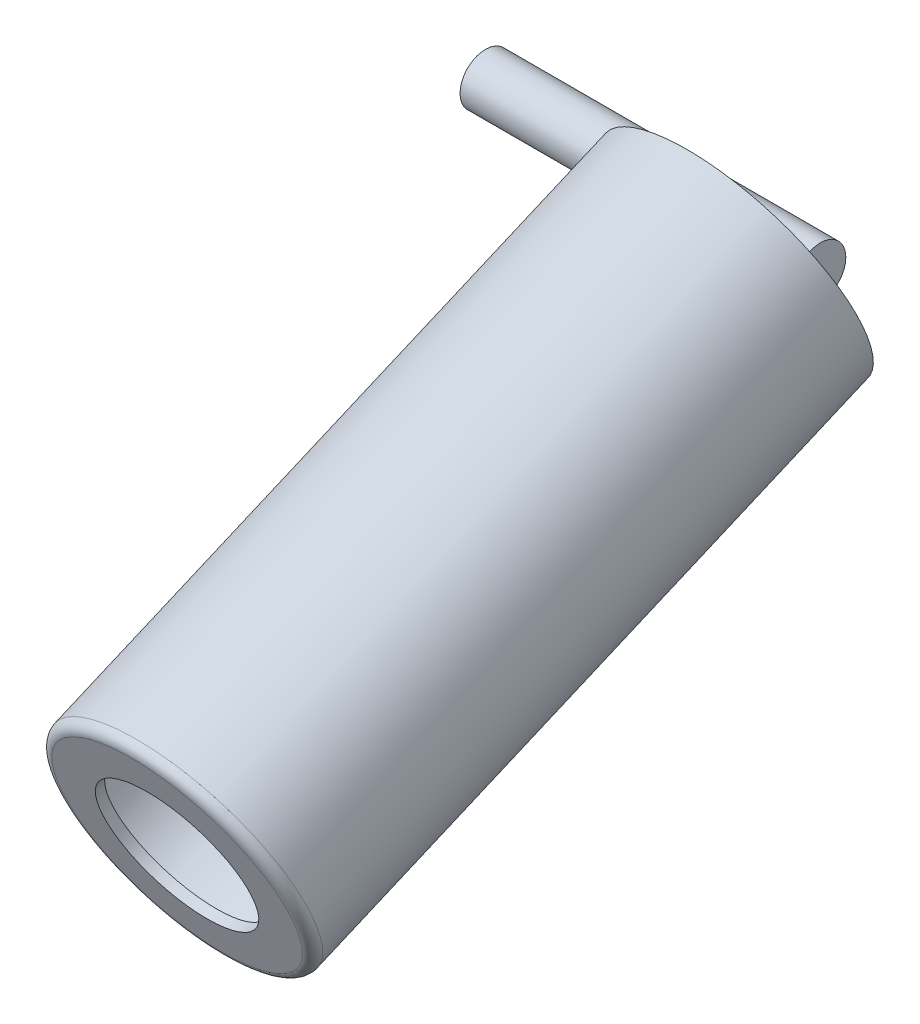
ISO-10303-21;
HEADER;
FILE_DESCRIPTION(('STEP AP214'),'2;1');
FILE_NAME('part.step','',(''),(''),'','','');
FILE_SCHEMA(('AUTOMOTIVE_DESIGN { 1 0 10303 214 1 1 1 1 }'));
ENDSEC;
DATA;
#1=APPLICATION_CONTEXT('core data for automotive mechanical design processes');
#2=APPLICATION_PROTOCOL_DEFINITION('international standard','automotive_design',2000,#1);
#3=PRODUCT_CONTEXT('',#1,'mechanical');
#4=PRODUCT('Part','Part','',(#3));
#5=PRODUCT_RELATED_PRODUCT_CATEGORY('part','',(#4));
#6=PRODUCT_DEFINITION_FORMATION('','',#4);
#7=PRODUCT_DEFINITION_CONTEXT('part definition',#1,'design');
#8=PRODUCT_DEFINITION('design','',#6,#7);
#9=PRODUCT_DEFINITION_SHAPE('','',#8);
#10=(LENGTH_UNIT() NAMED_UNIT(*) SI_UNIT(.MILLI.,.METRE.));
#11=(NAMED_UNIT(*) PLANE_ANGLE_UNIT() SI_UNIT($,.RADIAN.));
#12=(NAMED_UNIT(*) SI_UNIT($,.STERADIAN.) SOLID_ANGLE_UNIT());
#13=UNCERTAINTY_MEASURE_WITH_UNIT(LENGTH_MEASURE(1.E-05),#10,'distance_accuracy_value','');
#14=(GEOMETRIC_REPRESENTATION_CONTEXT(3) GLOBAL_UNCERTAINTY_ASSIGNED_CONTEXT((#13)) GLOBAL_UNIT_ASSIGNED_CONTEXT((#10,
#11,#12)) REPRESENTATION_CONTEXT('',''));
#15=CARTESIAN_POINT('',(0.,0.,0.));
#16=DIRECTION('',(0.,0.,1.));
#17=DIRECTION('',(1.,0.,0.));
#18=AXIS2_PLACEMENT_3D('',#15,#16,#17);
#19=CARTESIAN_POINT('',(-728.864439922494,-368.545794645224,1843.65524623048));
#20=DIRECTION('',(0.,-0.39320162856732,0.919452271350725));
#21=DIRECTION('',(0.,-0.919452271350725,-0.39320162856732));
#22=AXIS2_PLACEMENT_3D('',#19,#20,#21);
#23=PLANE('',#22);
#24=DIRECTION('',(0.,0.919452271350725,0.39320162856732));
#25=VECTOR('',#24,1.);
#26=CARTESIAN_POINT('',(-795.514439922492,-368.545794645224,1843.65524623048));
#27=LINE('',#26,#25);
#28=CARTESIAN_POINT('',(-795.514439922492,-385.492761657115,1836.40791514437));
#29=VERTEX_POINT('',#28);
#30=CARTESIAN_POINT('',(-795.514439922492,-381.727743522574,1838.01801640598));
#31=VERTEX_POINT('',#30);
#32=EDGE_CURVE('E11',#29,#31,#27,.T.);
#33=ORIENTED_EDGE('',*,*,#32,.F.);
#34=DIRECTION('',(-1.,0.,0.));
#35=VECTOR('',#34,1.);
#36=CARTESIAN_POINT('',(-665.514439922492,-385.492761657115,1836.40791514437));
#37=LINE('',#36,#35);
#38=CARTESIAN_POINT('',(-665.514439922492,-385.492761657115,1836.40791514437));
#39=VERTEX_POINT('',#38);
#40=EDGE_CURVE('E106',#39,#29,#37,.T.);
#41=ORIENTED_EDGE('',*,*,#40,.F.);
#42=DIRECTION('',(0.,-0.919452271350723,-0.393201628567325));
#43=VECTOR('',#42,1.);
#44=CARTESIAN_POINT('',(-665.514439922492,-385.492761657115,1836.40791514437));
#45=LINE('',#44,#43);
#46=CARTESIAN_POINT('',(-665.514439922492,-351.598827638869,1850.90257731422));
#47=VERTEX_POINT('',#46);
#48=EDGE_CURVE('E98',#47,#39,#45,.T.);
#49=ORIENTED_EDGE('',*,*,#48,.F.);
#50=DIRECTION('',(-1.,0.,0.));
#51=VECTOR('',#50,1.);
#52=CARTESIAN_POINT('',(-665.514439922492,-351.598827638869,1850.90257731422));
#53=LINE('',#52,#51);
#54=CARTESIAN_POINT('',(-795.514439922492,-351.598827638869,1850.90257731422));
#55=VERTEX_POINT('',#54);
#56=EDGE_CURVE('E114',#47,#55,#53,.T.);
#57=ORIENTED_EDGE('',*,*,#56,.T.);
#58=DIRECTION('',(0.,-0.919452271350723,-0.393201628567325));
#59=VECTOR('',#58,1.);
#60=CARTESIAN_POINT('',(-795.514439922492,-385.492761657115,1836.40791514437));
#61=LINE('',#60,#59);
#62=CARTESIAN_POINT('',(-795.514439922492,-355.363845774007,1849.29247605236));
#63=VERTEX_POINT('',#62);
#64=EDGE_CURVE('E118',#55,#63,#61,.T.);
#65=ORIENTED_EDGE('',*,*,#64,.T.);
#66=DIRECTION('',(-1.,0.,0.));
#67=VECTOR('',#66,1.);
#68=CARTESIAN_POINT('',(-795.514439922492,-355.363845774007,1849.29247605236));
#69=LINE('',#68,#67);
#70=CARTESIAN_POINT('',(-853.039549601898,-355.363845774007,1849.29247605236));
#71=VERTEX_POINT('',#70);
#72=EDGE_CURVE('E147',#71,#63,#69,.F.);
#73=ORIENTED_EDGE('',*,*,#72,.F.);
#74=CARTESIAN_POINT('',(-728.864439922494,-368.545794645224,1843.65524623048));
#75=DIRECTION('',(0.,-0.39320162856732,0.919452271350725));
#76=DIRECTION('',(0.,-0.919452271350725,-0.39320162856732));
#77=AXIS2_PLACEMENT_3D('',#74,#75,#76);
#78=CIRCLE('',#77,125.);
#79=CARTESIAN_POINT('',(-853.039549601127,-381.727743522574,1838.01801640598));
#80=VERTEX_POINT('',#79);
#81=EDGE_CURVE('E135',#80,#71,#78,.T.);
#82=ORIENTED_EDGE('',*,*,#81,.F.);
#83=DIRECTION('',(-1.,0.,0.));
#84=VECTOR('',#83,1.);
#85=CARTESIAN_POINT('',(-795.514439922492,-381.727743522574,1838.01801640598));
#86=LINE('',#85,#84);
#87=EDGE_CURVE('E142',#31,#80,#86,.T.);
#88=ORIENTED_EDGE('',*,*,#87,.F.);
#89=EDGE_LOOP('',(#33,#41,#49,#57,#65,#73,#82,#88));
#90=FACE_BOUND('',#89,.T.);
#91=ADVANCED_FACE('F37',(#90),#23,.F.);
#92=CARTESIAN_POINT('',(-728.864439922494,-368.545794645224,1843.65524623048));
#93=DIRECTION('',(0.,-0.39320162856732,0.919452271350725));
#94=DIRECTION('',(0.,-0.919452271350725,-0.39320162856732));
#95=AXIS2_PLACEMENT_3D('',#92,#93,#94);
#96=CYLINDRICAL_SURFACE('',#95,110.);
#97=CARTESIAN_POINT('',(-728.864439922494,-600.534755499943,2386.13208632741));
#98=DIRECTION('',(0.,-0.39320162856732,0.919452271350725));
#99=DIRECTION('',(0.,-0.919452271350725,-0.39320162856732));
#100=AXIS2_PLACEMENT_3D('',#97,#98,#99);
#101=CIRCLE('',#100,110.);
#102=CARTESIAN_POINT('',(-728.864439922494,-701.674505348523,2342.879907185));
#103=VERTEX_POINT('',#102);
#104=EDGE_CURVE('E156',#103,#103,#101,.F.);
#105=ORIENTED_EDGE('',*,*,#104,.F.);
#106=EDGE_LOOP('',(#105));
#107=FACE_BOUND('',#106,.T.);
#108=CARTESIAN_POINT('',(-728.864439922494,-372.477810930897,1852.84976894399));
#109=DIRECTION('',(0.,0.39320162856732,-0.919452271350725));
#110=DIRECTION('',(0.,0.919452271350725,0.39320162856732));
#111=AXIS2_PLACEMENT_3D('',#108,#109,#110);
#112=CIRCLE('',#111,110.);
#113=CARTESIAN_POINT('',(-728.864439922494,-271.338061082317,1896.10194808639));
#114=VERTEX_POINT('',#113);
#115=EDGE_CURVE('E45',#114,#114,#112,.F.);
#116=ORIENTED_EDGE('',*,*,#115,.F.);
#117=EDGE_LOOP('',(#116));
#118=FACE_BOUND('',#117,.T.);
#119=ADVANCED_FACE('F174',(#107,#118),#96,.F.);
#120=CARTESIAN_POINT('',(-795.514439922492,-360.492761655932,1824.82424722475));
#121=DIRECTION('',(-1.,0.,0.));
#122=DIRECTION('',(0.,0.,1.));
#123=AXIS2_PLACEMENT_3D('',#120,#121,#122);
#124=CYLINDRICAL_SURFACE('',#123,25.0000000016812);
#125=CARTESIAN_POINT('',(-795.514439922492,-360.492761655932,1824.82424722475));
#126=DIRECTION('',(-1.,0.,0.));
#127=DIRECTION('',(0.,0.,1.));
#128=AXIS2_PLACEMENT_3D('',#125,#126,#127);
#129=CIRCLE('',#128,25.0000000016812);
#130=CARTESIAN_POINT('',(-795.514439922492,-343.223137690102,1842.90075375029));
#131=VERTEX_POINT('',#130);
#132=EDGE_CURVE('E59',#63,#131,#129,.T.);
#133=ORIENTED_EDGE('',*,*,#132,.T.);
#134=DIRECTION('',(-1.,0.,0.));
#135=VECTOR('',#134,1.);
#136=CARTESIAN_POINT('',(-665.514439922492,-343.2231376901,1842.90075375029));
#137=LINE('',#136,#135);
#138=CARTESIAN_POINT('',(-665.514439922492,-343.2231376901,1842.90075375029));
#139=VERTEX_POINT('',#138);
#140=EDGE_CURVE('E107',#139,#131,#137,.T.);
#141=ORIENTED_EDGE('',*,*,#140,.F.);
#142=CARTESIAN_POINT('',(-665.514439922492,-360.492761655687,1824.824247225));
#143=DIRECTION('',(1.,0.,0.));
#144=DIRECTION('',(0.,0.,-1.));
#145=AXIS2_PLACEMENT_3D('',#142,#143,#144);
#146=CIRCLE('',#145,25.0000000014281);
#147=CARTESIAN_POINT('',(-665.514439922492,-385.492761657115,1824.824247225));
#148=VERTEX_POINT('',#147);
#149=EDGE_CURVE('E97',#148,#139,#146,.T.);
#150=ORIENTED_EDGE('',*,*,#149,.F.);
#151=DIRECTION('',(-1.,0.,0.));
#152=VECTOR('',#151,1.);
#153=CARTESIAN_POINT('',(-665.514439922492,-385.492761657115,1824.824247225));
#154=LINE('',#153,#152);
#155=CARTESIAN_POINT('',(-795.514439922492,-385.492761657614,1824.824247225));
#156=VERTEX_POINT('',#155);
#157=EDGE_CURVE('E103',#148,#156,#154,.T.);
#158=ORIENTED_EDGE('',*,*,#157,.T.);
#159=CARTESIAN_POINT('',(-795.514439922492,-360.492761655932,1824.82424722475));
#160=DIRECTION('',(1.,0.,0.));
#161=DIRECTION('',(0.,0.,-1.));
#162=AXIS2_PLACEMENT_3D('',#159,#160,#161);
#163=CIRCLE('',#162,25.0000000016812);
#164=EDGE_CURVE('E51',#156,#31,#163,.F.);
#165=ORIENTED_EDGE('',*,*,#164,.T.);
#166=ORIENTED_EDGE('',*,*,#87,.T.);
#167=CARTESIAN_POINT('',(-853.039549601898,-355.363845774007,1849.29247605236));
#168=CARTESIAN_POINT('',(-853.072420317493,-355.703974164428,1849.36377143738));
#169=CARTESIAN_POINT('',(-853.104777784765,-356.045596532241,1849.42797662834));
#170=CARTESIAN_POINT('',(-853.168256476335,-356.7313350855,1849.54210561734));
#171=CARTESIAN_POINT('',(-853.199377691154,-357.075451290043,1849.59202930588));
#172=CARTESIAN_POINT('',(-853.29056107963,-358.110672298176,1849.72021036117));
#173=CARTESIAN_POINT('',(-853.348454503559,-358.804767399092,1849.77690242885));
#174=CARTESIAN_POINT('',(-853.456822277803,-360.195738290107,1849.83217353611));
#175=CARTESIAN_POINT('',(-853.50729689717,-360.892613978422,1849.8307546837));
#176=CARTESIAN_POINT('',(-853.599441566902,-362.284397090763,1849.76969049601));
#177=CARTESIAN_POINT('',(-853.641111970284,-362.979304592603,1849.71004749587));
#178=CARTESIAN_POINT('',(-853.714520843665,-364.362863614294,1849.53273156854));
#179=CARTESIAN_POINT('',(-853.746250085512,-365.051508748667,1849.41500498311));
#180=CARTESIAN_POINT('',(-853.798834128951,-366.416947308596,1849.12222151572));
#181=CARTESIAN_POINT('',(-853.819688704584,-367.093740487604,1848.94716344263));
#182=CARTESIAN_POINT('',(-853.849926098879,-368.430203440157,1848.5410041501));
#183=CARTESIAN_POINT('',(-853.859314462004,-369.089881338602,1848.30993008193));
#184=CARTESIAN_POINT('',(-853.866371939789,-370.387614589116,1847.7933482882));
#185=CARTESIAN_POINT('',(-853.864041394773,-371.025670568557,1847.50784214362));
#186=CARTESIAN_POINT('',(-853.847817182837,-372.268723299647,1846.88787961654));
#187=CARTESIAN_POINT('',(-853.834049462447,-372.874003981379,1846.55398896279));
#188=CARTESIAN_POINT('',(-853.795493808783,-374.054627060381,1845.83740152395));
#189=CARTESIAN_POINT('',(-853.770705297062,-374.629967884433,1845.45470217781));
#190=CARTESIAN_POINT('',(-853.710792198906,-375.746658094681,1844.6433050543));
#191=CARTESIAN_POINT('',(-853.675667442767,-376.288006922604,1844.21460652176));
#192=CARTESIAN_POINT('',(-853.596046324387,-377.332934425016,1843.31435109866));
#193=CARTESIAN_POINT('',(-853.551552031932,-377.836521408056,1842.84280368673));
#194=CARTESIAN_POINT('',(-853.470463702041,-378.642974177829,1842.02258396245));
#195=CARTESIAN_POINT('',(-853.436114114153,-378.95719987603,1841.68476795553));
#196=CARTESIAN_POINT('',(-853.3641795148,-379.566326413036,1840.99247658881));
#197=CARTESIAN_POINT('',(-853.326594728115,-379.861228591929,1840.63800238718));
#198=CARTESIAN_POINT('',(-853.248723115012,-380.430250575802,1839.91424321958));
#199=CARTESIAN_POINT('',(-853.208442061254,-380.704412262536,1839.54499053554));
#200=CARTESIAN_POINT('',(-853.125589842305,-381.231908405278,1838.79204163047));
#201=CARTESIAN_POINT('',(-853.083018257682,-381.485239025152,1838.40834276801));
#202=CARTESIAN_POINT('',(-853.039549601127,-381.727743522574,1838.01801640598));
#203=B_SPLINE_CURVE_WITH_KNOTS('',3,(#167,#168,#169,#170,#171,#172,#173,#174,#175,#176,#177,
#178,#179,#180,#181,#182,#183,#184,#185,#186,#187,#188,#189,#190,#191,#192,#193,#194,#195,#196,
#197,#198,#199,#200,#201,#202),.UNSPECIFIED.,.F.,.F.,(4,2,2,2,2,2,2,2,2,2,2,2,2,2,2,2,2,4),(0.,
1.04705655194005,2.0941211303209,4.18788839066826,6.28157969864008,8.3751870409038,
10.4707321120092,12.5663207235661,14.6608956155847,16.7554096801876,18.8271599794869,
20.8990190312053,22.970912101564,25.0423479577928,26.4296211799663,27.8167980925424,
29.2010946223801,30.5856455083696),.UNSPECIFIED.);
#204=EDGE_CURVE('E149',#71,#80,#203,.T.);
#205=ORIENTED_EDGE('',*,*,#204,.F.);
#206=ORIENTED_EDGE('',*,*,#72,.T.);
#207=EDGE_LOOP('',(#133,#141,#150,#158,#165,#166,#205,#206));
#208=FACE_BOUND('',#207,.T.);
#209=CARTESIAN_POINT('',(-995.514439922492,-360.492761655932,1824.82424722475));
#210=DIRECTION('',(-1.,0.,0.));
#211=DIRECTION('',(0.,0.,1.));
#212=AXIS2_PLACEMENT_3D('',#209,#210,#211);
#213=CIRCLE('',#212,25.0000000016812);
#214=CARTESIAN_POINT('',(-995.514439922492,-360.492761655932,1849.82424722643));
#215=VERTEX_POINT('',#214);
#216=EDGE_CURVE('E140',#215,#215,#213,.T.);
#217=ORIENTED_EDGE('',*,*,#216,.F.);
#218=EDGE_LOOP('',(#217));
#219=FACE_BOUND('',#218,.T.);
#220=ADVANCED_FACE('F109',(#208,#219),#124,.T.);
#221=CARTESIAN_POINT('',(-995.514439922492,-360.492761655932,1824.82424722475));
#222=DIRECTION('',(-1.,0.,0.));
#223=DIRECTION('',(0.,0.,1.));
#224=AXIS2_PLACEMENT_3D('',#221,#222,#223);
#225=PLANE('',#224);
#226=ORIENTED_EDGE('',*,*,#216,.T.);
#227=EDGE_LOOP('',(#226));
#228=FACE_BOUND('',#227,.T.);
#229=ADVANCED_FACE('F165',(#228),#225,.T.);
#230=CARTESIAN_POINT('',(-728.864439922494,-368.545794645224,1843.65524623048));
#231=DIRECTION('',(0.,-0.39320162856732,0.919452271350725));
#232=DIRECTION('',(0.,-0.919452271350725,-0.39320162856732));
#233=AXIS2_PLACEMENT_3D('',#230,#231,#232);
#234=CYLINDRICAL_SURFACE('',#233,125.);
#235=ORIENTED_EDGE('',*,*,#81,.T.);
#236=ORIENTED_EDGE('',*,*,#204,.T.);
#237=EDGE_LOOP('',(#235,#236));
#238=FACE_BOUND('',#237,.T.);
#239=CARTESIAN_POINT('',(-728.864439922494,-600.534755499943,2386.13208632741));
#240=DIRECTION('',(0.,-0.39320162856732,0.919452271350725));
#241=DIRECTION('',(0.,-0.919452271350725,-0.39320162856732));
#242=AXIS2_PLACEMENT_3D('',#239,#240,#241);
#243=CIRCLE('',#242,125.);
#244=CARTESIAN_POINT('',(-728.864439922494,-715.466289418784,2336.98188275649));
#245=VERTEX_POINT('',#244);
#246=EDGE_CURVE('E131',#245,#245,#243,.F.);
#247=ORIENTED_EDGE('',*,*,#246,.T.);
#248=EDGE_LOOP('',(#247));
#249=FACE_BOUND('',#248,.T.);
#250=ADVANCED_FACE('F160',(#238,#249),#234,.T.);
#251=CARTESIAN_POINT('',(-728.864439922494,-604.466771785616,2395.32660904091));
#252=DIRECTION('',(0.,-0.39320162856732,0.919452271350725));
#253=DIRECTION('',(0.,-0.919452271350725,-0.39320162856732));
#254=AXIS2_PLACEMENT_3D('',#251,#252,#253);
#255=PLANE('',#254);
#256=CARTESIAN_POINT('',(-728.864439922494,-604.466771785616,2395.32660904091));
#257=DIRECTION('',(0.,-0.39320162856732,0.919452271350725));
#258=DIRECTION('',(0.,-0.919452271350725,-0.39320162856732));
#259=AXIS2_PLACEMENT_3D('',#256,#257,#258);
#260=CIRCLE('',#259,115.);
#261=CARTESIAN_POINT('',(-728.864439922494,-710.20378299095,2350.10842175567));
#262=VERTEX_POINT('',#261);
#263=EDGE_CURVE('E279',#262,#262,#260,.T.);
#264=ORIENTED_EDGE('',*,*,#263,.T.);
#265=EDGE_LOOP('',(#264));
#266=FACE_BOUND('',#265,.T.);
#267=CARTESIAN_POINT('',(-728.864439922494,-604.466771785616,2395.32660904091));
#268=DIRECTION('',(0.,-0.39320162856732,0.919452271350725));
#269=DIRECTION('',(0.,-0.919452271350725,-0.39320162856732));
#270=AXIS2_PLACEMENT_3D('',#267,#268,#269);
#271=CIRCLE('',#270,74.9999999996402);
#272=CARTESIAN_POINT('',(-728.864439922494,-673.42569213659,2365.83648689851));
#273=VERTEX_POINT('',#272);
#274=EDGE_CURVE('E128',#273,#273,#271,.T.);
#275=ORIENTED_EDGE('',*,*,#274,.F.);
#276=EDGE_LOOP('',(#275));
#277=FACE_BOUND('',#276,.T.);
#278=ADVANCED_FACE('F164',(#266,#277),#255,.T.);
#279=CARTESIAN_POINT('',(-728.864439922494,-600.534755499943,2386.13208632741));
#280=DIRECTION('',(0.,-0.39320162856732,0.919452271350725));
#281=DIRECTION('',(0.,-0.919452271350725,-0.39320162856732));
#282=AXIS2_PLACEMENT_3D('',#279,#280,#281);
#283=PLANE('',#282);
#284=CARTESIAN_POINT('',(-728.864439922494,-600.534755499943,2386.13208632741));
#285=DIRECTION('',(0.,-0.39320162856732,0.919452271350725));
#286=DIRECTION('',(0.,-0.919452271350725,-0.39320162856732));
#287=AXIS2_PLACEMENT_3D('',#284,#285,#286);
#288=CIRCLE('',#287,74.9999999996402);
#289=CARTESIAN_POINT('',(-728.864439922494,-669.493675850917,2356.641964185));
#290=VERTEX_POINT('',#289);
#291=EDGE_CURVE('E132',#290,#290,#288,.T.);
#292=ORIENTED_EDGE('',*,*,#291,.T.);
#293=EDGE_LOOP('',(#292));
#294=FACE_BOUND('',#293,.T.);
#295=ORIENTED_EDGE('',*,*,#104,.T.);
#296=EDGE_LOOP('',(#295));
#297=FACE_BOUND('',#296,.T.);
#298=ADVANCED_FACE('F184',(#294,#297),#283,.F.);
#299=CARTESIAN_POINT('',(-728.864439922494,-600.534755499943,2386.13208632741));
#300=DIRECTION('',(0.,-0.39320162856732,0.919452271350725));
#301=DIRECTION('',(0.,-0.919452271350725,-0.39320162856732));
#302=AXIS2_PLACEMENT_3D('',#299,#300,#301);
#303=CYLINDRICAL_SURFACE('',#302,74.9999999996402);
#304=CARTESIAN_POINT('',(-728.864439922494,-669.493675850917,2356.641964185));
#305=CARTESIAN_POINT('',(-728.864439922494,-669.534634353892,2356.73774046326));
#306=CARTESIAN_POINT('',(-728.864439922494,-669.575592856868,2356.83351674153));
#307=CARTESIAN_POINT('',(-728.864439922494,-669.65750986282,2357.02506929806));
#308=CARTESIAN_POINT('',(-728.864439922494,-669.698468365795,2357.12084557633));
#309=CARTESIAN_POINT('',(-728.864439922494,-669.780385371747,2357.31239813286));
#310=CARTESIAN_POINT('',(-728.864439922494,-669.821343874723,2357.40817441112));
#311=CARTESIAN_POINT('',(-728.864439922494,-669.903260880674,2357.59972696766));
#312=CARTESIAN_POINT('',(-728.864439922494,-669.94421938365,2357.69550324592));
#313=CARTESIAN_POINT('',(-728.864439922494,-670.026136389601,2357.88705580245));
#314=CARTESIAN_POINT('',(-728.864439922494,-670.067094892577,2357.98283208072));
#315=CARTESIAN_POINT('',(-728.864439922494,-670.149011898529,2358.17438463725));
#316=CARTESIAN_POINT('',(-728.864439922494,-670.189970401504,2358.27016091552));
#317=CARTESIAN_POINT('',(-728.864439922494,-670.271887407456,2358.46171347205));
#318=CARTESIAN_POINT('',(-728.864439922494,-670.312845910432,2358.55748975031));
#319=CARTESIAN_POINT('',(-728.864439922494,-670.394762916383,2358.74904230684));
#320=CARTESIAN_POINT('',(-728.864439922494,-670.435721419359,2358.84481858511));
#321=CARTESIAN_POINT('',(-728.864439922494,-670.517638425311,2359.03637114164));
#322=CARTESIAN_POINT('',(-728.864439922494,-670.558596928286,2359.13214741991));
#323=CARTESIAN_POINT('',(-728.864439922494,-670.640513934238,2359.32369997644));
#324=CARTESIAN_POINT('',(-728.864439922494,-670.681472437214,2359.4194762547));
#325=CARTESIAN_POINT('',(-728.864439922494,-670.763389443165,2359.61102881124));
#326=CARTESIAN_POINT('',(-728.864439922494,-670.804347946141,2359.7068050895));
#327=CARTESIAN_POINT('',(-728.864439922494,-670.886264952092,2359.89835764603));
#328=CARTESIAN_POINT('',(-728.864439922494,-670.927223455068,2359.9941339243));
#329=CARTESIAN_POINT('',(-728.864439922494,-671.00914046102,2360.18568648083));
#330=CARTESIAN_POINT('',(-728.864439922494,-671.050098963995,2360.2814627591));
#331=CARTESIAN_POINT('',(-728.864439922494,-671.132015969947,2360.47301531563));
#332=CARTESIAN_POINT('',(-728.864439922494,-671.172974472923,2360.56879159389));
#333=CARTESIAN_POINT('',(-728.864439922494,-671.254891478874,2360.76034415042));
#334=CARTESIAN_POINT('',(-728.864439922494,-671.29584998185,2360.85612042869));
#335=CARTESIAN_POINT('',(-728.864439922494,-671.377766987802,2361.04767298522));
#336=CARTESIAN_POINT('',(-728.864439922494,-671.418725490777,2361.14344926349));
#337=CARTESIAN_POINT('',(-728.864439922494,-671.500642496729,2361.33500182002));
#338=CARTESIAN_POINT('',(-728.864439922494,-671.541600999705,2361.43077809828));
#339=CARTESIAN_POINT('',(-728.864439922494,-671.623518005656,2361.62233065481));
#340=CARTESIAN_POINT('',(-728.864439922494,-671.664476508632,2361.71810693308));
#341=CARTESIAN_POINT('',(-728.864439922494,-671.746393514583,2361.90965948961));
#342=CARTESIAN_POINT('',(-728.864439922494,-671.787352017559,2362.00543576788));
#343=CARTESIAN_POINT('',(-728.864439922494,-671.869269023511,2362.19698832441));
#344=CARTESIAN_POINT('',(-728.864439922494,-671.910227526486,2362.29276460268));
#345=CARTESIAN_POINT('',(-728.864439922494,-671.992144532438,2362.48431715921));
#346=CARTESIAN_POINT('',(-728.864439922494,-672.033103035414,2362.58009343747));
#347=CARTESIAN_POINT('',(-728.864439922494,-672.115020041365,2362.771645994));
#348=CARTESIAN_POINT('',(-728.864439922494,-672.155978544341,2362.86742227227));
#349=CARTESIAN_POINT('',(-728.864439922494,-672.237895550293,2363.0589748288));
#350=CARTESIAN_POINT('',(-728.864439922494,-672.278854053268,2363.15475110707));
#351=CARTESIAN_POINT('',(-728.864439922494,-672.36077105922,2363.3463036636));
#352=CARTESIAN_POINT('',(-728.864439922494,-672.401729562196,2363.44207994186));
#353=CARTESIAN_POINT('',(-728.864439922494,-672.483646568147,2363.63363249839));
#354=CARTESIAN_POINT('',(-728.864439922494,-672.524605071123,2363.72940877666));
#355=CARTESIAN_POINT('',(-728.864439922494,-672.606522077074,2363.92096133319));
#356=CARTESIAN_POINT('',(-728.864439922494,-672.64748058005,2364.01673761146));
#357=CARTESIAN_POINT('',(-728.864439922494,-672.729397586002,2364.20829016799));
#358=CARTESIAN_POINT('',(-728.864439922494,-672.770356088977,2364.30406644625));
#359=CARTESIAN_POINT('',(-728.864439922494,-672.852273094929,2364.49561900279));
#360=CARTESIAN_POINT('',(-728.864439922494,-672.893231597905,2364.59139528105));
#361=CARTESIAN_POINT('',(-728.864439922494,-672.975148603856,2364.78294783758));
#362=CARTESIAN_POINT('',(-728.864439922494,-673.016107106832,2364.87872411585));
#363=CARTESIAN_POINT('',(-728.864439922494,-673.098024112784,2365.07027667238));
#364=CARTESIAN_POINT('',(-728.864439922494,-673.138982615759,2365.16605295065));
#365=CARTESIAN_POINT('',(-728.864439922494,-673.220899621711,2365.35760550718));
#366=CARTESIAN_POINT('',(-728.864439922494,-673.261858124687,2365.45338178544));
#367=CARTESIAN_POINT('',(-728.864439922494,-673.343775130638,2365.64493434197));
#368=CARTESIAN_POINT('',(-728.864439922494,-673.384733633614,2365.74071062024));
#369=CARTESIAN_POINT('',(-728.864439922494,-673.42569213659,2365.83648689851));
#370=B_SPLINE_CURVE_WITH_KNOTS('',3,(#304,#305,#306,#307,#308,#309,#310,#311,#312,#313,#314,
#315,#316,#317,#318,#319,#320,#321,#322,#323,#324,#325,#326,#327,#328,#329,#330,#331,#332,#333,
#334,#335,#336,#337,#338,#339,#340,#341,#342,#343,#344,#345,#346,#347,#348,#349,#350,#351,#352,
#353,#354,#355,#356,#357,#358,#359,#360,#361,#362,#363,#364,#365,#366,#367,#368,#369),
.UNSPECIFIED.,.F.,.F.,(4,2,2,2,2,2,2,2,2,2,2,2,2,2,2,2,2,2,2,2,2,2,2,2,2,2,2,2,2,2,2,2,4),(0.,
0.312500000000208,0.625000000000373,0.937500000000173,1.25000000000038,1.56250000000018,
1.87500000000035,2.18750000000015,2.50000000000035,2.81250000000015,3.12500000000032,
3.43750000000012,3.75000000000033,4.06250000000013,4.37500000000034,4.68750000000009,
4.99999999999989,5.3125000000001,5.62500000000031,5.93750000000007,6.25000000000027,
6.56250000000007,6.87500000000028,7.18750000000004,7.49999999999984,7.81250000000005,
8.12500000000026,8.43750000000001,8.75000000000022,9.06250000000002,9.37500000000023,
9.68750000000003,10.0000000000002),.UNSPECIFIED.);
#371=EDGE_CURVE('BSEAM186',#290,#273,#370,.T.);
#372=ORIENTED_EDGE('',*,*,#291,.F.);
#373=ORIENTED_EDGE('',*,*,#274,.T.);
#374=ORIENTED_EDGE('',*,*,#371,.T.);
#375=ORIENTED_EDGE('',*,*,#371,.F.);
#376=EDGE_LOOP('',(#372,#374,#373,#375));
#377=FACE_BOUND('',#376,.T.);
#378=ADVANCED_FACE('F186',(#377),#303,.F.);
#379=CARTESIAN_POINT('',(-728.864439922494,-600.534755499943,2386.13208632741));
#380=DIRECTION('',(0.,-0.39320162856732,0.919452271350725));
#381=DIRECTION('',(0.,-0.919452271350725,-0.39320162856732));
#382=AXIS2_PLACEMENT_3D('',#379,#380,#381);
#383=TOROIDAL_SURFACE('',#382,115.,10.);
#384=ORIENTED_EDGE('',*,*,#246,.F.);
#385=EDGE_LOOP('',(#384));
#386=FACE_BOUND('',#385,.T.);
#387=ORIENTED_EDGE('',*,*,#263,.F.);
#388=EDGE_LOOP('',(#387));
#389=FACE_BOUND('',#388,.T.);
#390=ADVANCED_FACE('F39',(#386,#389),#383,.T.);
#391=CARTESIAN_POINT('',(-728.864439922494,-372.477810930897,1852.84976894399));
#392=DIRECTION('',(0.,0.39320162856732,-0.919452271350725));
#393=DIRECTION('',(0.,0.919452271350725,0.39320162856732));
#394=AXIS2_PLACEMENT_3D('',#391,#392,#393);
#395=PLANE('',#394);
#396=ORIENTED_EDGE('',*,*,#115,.T.);
#397=EDGE_LOOP('',(#396));
#398=FACE_BOUND('',#397,.T.);
#399=ADVANCED_FACE('F191',(#398),#395,.F.);
#400=CARTESIAN_POINT('',(-795.514439922492,-360.492761655687,1824.824247225));
#401=DIRECTION('',(1.,0.,0.));
#402=DIRECTION('',(0.,0.,-1.));
#403=AXIS2_PLACEMENT_3D('',#400,#401,#402);
#404=PLANE('',#403);
#405=ORIENTED_EDGE('',*,*,#164,.F.);
#406=DIRECTION('',(0.,0.,-1.));
#407=VECTOR('',#406,1.);
#408=CARTESIAN_POINT('',(-795.514439922492,-385.492761657115,1824.824247225));
#409=LINE('',#408,#407);
#410=EDGE_CURVE('E105',#29,#156,#409,.T.);
#411=ORIENTED_EDGE('',*,*,#410,.F.);
#412=ORIENTED_EDGE('',*,*,#32,.T.);
#413=EDGE_LOOP('',(#405,#411,#412));
#414=FACE_BOUND('',#413,.T.);
#415=ADVANCED_FACE('F193',(#414),#404,.F.);
#416=CARTESIAN_POINT('',(-665.514439922492,-385.492761657115,1824.824247225));
#417=DIRECTION('',(0.,1.,0.));
#418=DIRECTION('',(0.,0.,1.));
#419=AXIS2_PLACEMENT_3D('',#416,#417,#418);
#420=PLANE('',#419);
#421=ORIENTED_EDGE('',*,*,#410,.T.);
#422=ORIENTED_EDGE('',*,*,#157,.F.);
#423=DIRECTION('',(0.,0.,-1.));
#424=VECTOR('',#423,1.);
#425=CARTESIAN_POINT('',(-665.514439922492,-385.492761657115,1824.824247225));
#426=LINE('',#425,#424);
#427=EDGE_CURVE('E92',#39,#148,#426,.T.);
#428=ORIENTED_EDGE('',*,*,#427,.F.);
#429=ORIENTED_EDGE('',*,*,#40,.T.);
#430=EDGE_LOOP('',(#421,#422,#428,#429));
#431=FACE_BOUND('',#430,.T.);
#432=ADVANCED_FACE('F104',(#431),#420,.F.);
#433=CARTESIAN_POINT('',(-665.514439922492,-351.598827638869,1850.90257731422));
#434=DIRECTION('',(0.,-0.690784958584006,-0.723060260970061));
#435=DIRECTION('',(0.,0.723060260970061,-0.690784958584006));
#436=AXIS2_PLACEMENT_3D('',#433,#434,#435);
#437=PLANE('',#436);
#438=DIRECTION('',(0.,-0.723060260970061,0.690784958584006));
#439=VECTOR('',#438,1.);
#440=CARTESIAN_POINT('',(-795.514439922492,-351.598827638869,1850.90257731422));
#441=LINE('',#440,#439);
#442=EDGE_CURVE('E121',#131,#55,#441,.T.);
#443=ORIENTED_EDGE('',*,*,#442,.T.);
#444=ORIENTED_EDGE('',*,*,#56,.F.);
#445=DIRECTION('',(0.,-0.723060260970061,0.690784958584006));
#446=VECTOR('',#445,1.);
#447=CARTESIAN_POINT('',(-665.514439922492,-351.598827638869,1850.90257731422));
#448=LINE('',#447,#446);
#449=EDGE_CURVE('E112',#139,#47,#448,.T.);
#450=ORIENTED_EDGE('',*,*,#449,.F.);
#451=ORIENTED_EDGE('',*,*,#140,.T.);
#452=EDGE_LOOP('',(#443,#444,#450,#451));
#453=FACE_BOUND('',#452,.T.);
#454=ADVANCED_FACE('F197',(#453),#437,.F.);
#455=CARTESIAN_POINT('',(-665.514439922492,-360.492761655687,1824.824247225));
#456=DIRECTION('',(1.,0.,0.));
#457=DIRECTION('',(0.,0.,-1.));
#458=AXIS2_PLACEMENT_3D('',#455,#456,#457);
#459=PLANE('',#458);
#460=ORIENTED_EDGE('',*,*,#48,.T.);
#461=ORIENTED_EDGE('',*,*,#427,.T.);
#462=ORIENTED_EDGE('',*,*,#149,.T.);
#463=ORIENTED_EDGE('',*,*,#449,.T.);
#464=EDGE_LOOP('',(#460,#461,#462,#463));
#465=FACE_BOUND('',#464,.T.);
#466=ADVANCED_FACE('F94',(#465),#459,.T.);
#467=ORIENTED_EDGE('',*,*,#132,.F.);
#468=ORIENTED_EDGE('',*,*,#64,.F.);
#469=ORIENTED_EDGE('',*,*,#442,.F.);
#470=EDGE_LOOP('',(#467,#468,#469));
#471=FACE_BOUND('',#470,.T.);
#472=ADVANCED_FACE('F201',(#471),#404,.F.);
#473=CLOSED_SHELL('',(#91,#119,#220,#229,#250,#278,#298,#378,#390,#399,#415,#432,#454,#466,#472));
#474=MANIFOLD_SOLID_BREP('B2',#473);
#475=ADVANCED_BREP_SHAPE_REPRESENTATION('',(#18,#474),#14);
#476=SHAPE_DEFINITION_REPRESENTATION(#9,#475);
ENDSEC;
END-ISO-10303-21;
